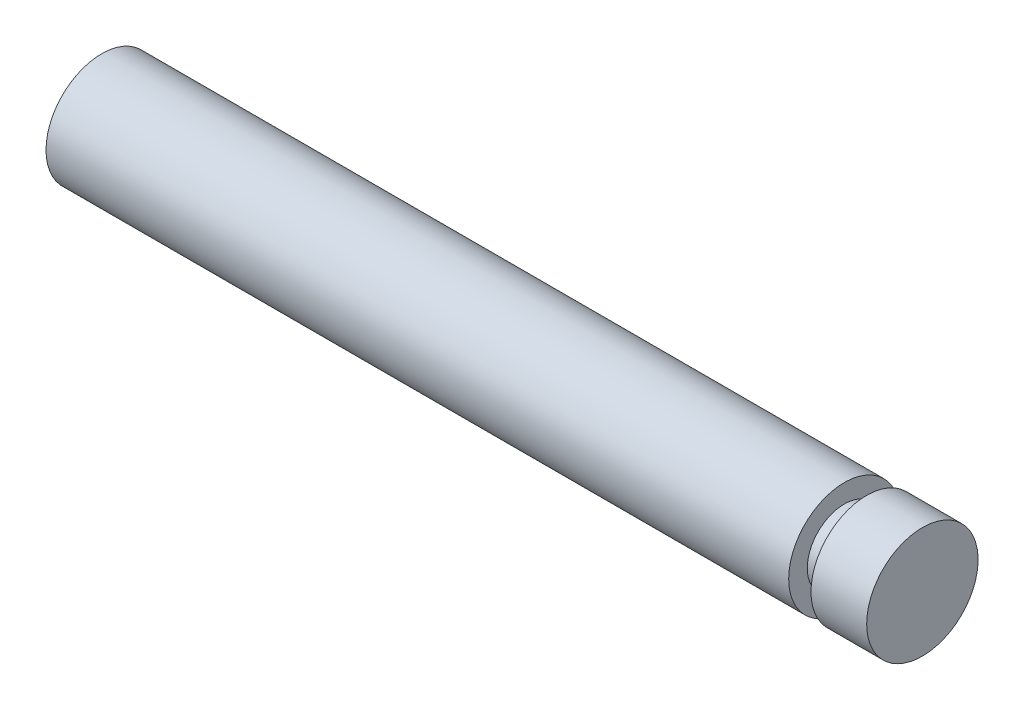
ISO-10303-21;
HEADER;
FILE_DESCRIPTION(('STEP AP214'),'2;1');
FILE_NAME('part.step','',(''),(''),'','','');
FILE_SCHEMA(('AUTOMOTIVE_DESIGN { 1 0 10303 214 1 1 1 1 }'));
ENDSEC;
DATA;
#1=APPLICATION_CONTEXT('core data for automotive mechanical design processes');
#2=APPLICATION_PROTOCOL_DEFINITION('international standard','automotive_design',2000,#1);
#3=PRODUCT_CONTEXT('',#1,'mechanical');
#4=PRODUCT('Part','Part','',(#3));
#5=PRODUCT_RELATED_PRODUCT_CATEGORY('part','',(#4));
#6=PRODUCT_DEFINITION_FORMATION('','',#4);
#7=PRODUCT_DEFINITION_CONTEXT('part definition',#1,'design');
#8=PRODUCT_DEFINITION('design','',#6,#7);
#9=PRODUCT_DEFINITION_SHAPE('','',#8);
#10=(LENGTH_UNIT() NAMED_UNIT(*) SI_UNIT(.MILLI.,.METRE.));
#11=(NAMED_UNIT(*) PLANE_ANGLE_UNIT() SI_UNIT($,.RADIAN.));
#12=(NAMED_UNIT(*) SI_UNIT($,.STERADIAN.) SOLID_ANGLE_UNIT());
#13=UNCERTAINTY_MEASURE_WITH_UNIT(LENGTH_MEASURE(1.E-05),#10,'distance_accuracy_value','');
#14=(GEOMETRIC_REPRESENTATION_CONTEXT(3) GLOBAL_UNCERTAINTY_ASSIGNED_CONTEXT((#13)) GLOBAL_UNIT_ASSIGNED_CONTEXT((#10,
#11,#12)) REPRESENTATION_CONTEXT('',''));
#15=CARTESIAN_POINT('',(0.,0.,0.));
#16=DIRECTION('',(0.,0.,1.));
#17=DIRECTION('',(1.,0.,0.));
#18=AXIS2_PLACEMENT_3D('',#15,#16,#17);
#19=CARTESIAN_POINT('',(0.,0.,0.));
#20=DIRECTION('',(1.,0.,0.));
#21=DIRECTION('',(0.,0.,-1.));
#22=AXIS2_PLACEMENT_3D('',#19,#20,#21);
#23=PLANE('',#22);
#24=CARTESIAN_POINT('',(0.,0.,0.));
#25=DIRECTION('',(-1.,0.,0.));
#26=DIRECTION('',(0.,0.,1.));
#27=AXIS2_PLACEMENT_3D('',#24,#25,#26);
#28=CIRCLE('',#27,3.);
#29=CARTESIAN_POINT('',(0.,0.,3.));
#30=VERTEX_POINT('',#29);
#31=EDGE_CURVE('E10',#30,#30,#28,.T.);
#32=ORIENTED_EDGE('',*,*,#31,.T.);
#33=EDGE_LOOP('',(#32));
#34=FACE_BOUND('',#33,.T.);
#35=ADVANCED_FACE('F43',(#34),#23,.F.);
#36=CARTESIAN_POINT('',(0.,0.,0.));
#37=DIRECTION('',(-1.,0.,0.));
#38=DIRECTION('',(0.,0.,1.));
#39=AXIS2_PLACEMENT_3D('',#36,#37,#38);
#40=CYLINDRICAL_SURFACE('',#39,3.);
#41=ORIENTED_EDGE('',*,*,#31,.F.);
#42=EDGE_LOOP('',(#41));
#43=FACE_BOUND('',#42,.T.);
#44=CARTESIAN_POINT('',(39.9915,0.,0.));
#45=DIRECTION('',(-1.,0.,0.));
#46=DIRECTION('',(0.,0.,1.));
#47=AXIS2_PLACEMENT_3D('',#44,#45,#46);
#48=CIRCLE('',#47,3.);
#49=CARTESIAN_POINT('',(39.9915,0.,3.));
#50=VERTEX_POINT('',#49);
#51=EDGE_CURVE('E50',#50,#50,#48,.T.);
#52=ORIENTED_EDGE('',*,*,#51,.T.);
#53=EDGE_LOOP('',(#52));
#54=FACE_BOUND('',#53,.T.);
#55=ADVANCED_FACE('F87',(#43,#54),#40,.T.);
#56=CARTESIAN_POINT('',(39.9915,3.,0.));
#57=DIRECTION('',(-1.,0.,0.));
#58=DIRECTION('',(0.,0.,1.));
#59=AXIS2_PLACEMENT_3D('',#56,#57,#58);
#60=PLANE('',#59);
#61=ORIENTED_EDGE('',*,*,#51,.F.);
#62=EDGE_LOOP('',(#61));
#63=FACE_BOUND('',#62,.T.);
#64=CARTESIAN_POINT('',(39.9915,0.,0.));
#65=DIRECTION('',(-1.,0.,0.));
#66=DIRECTION('',(0.,0.,1.));
#67=AXIS2_PLACEMENT_3D('',#64,#65,#66);
#68=CIRCLE('',#67,2.);
#69=CARTESIAN_POINT('',(39.9915,0.,2.));
#70=VERTEX_POINT('',#69);
#71=EDGE_CURVE('E55',#70,#70,#68,.T.);
#72=ORIENTED_EDGE('',*,*,#71,.T.);
#73=EDGE_LOOP('',(#72));
#74=FACE_BOUND('',#73,.T.);
#75=ADVANCED_FACE('F91',(#63,#74),#60,.F.);
#76=CARTESIAN_POINT('',(0.,0.,0.));
#77=DIRECTION('',(-1.,0.,0.));
#78=DIRECTION('',(0.,0.,1.));
#79=AXIS2_PLACEMENT_3D('',#76,#77,#78);
#80=CYLINDRICAL_SURFACE('',#79,2.);
#81=ORIENTED_EDGE('',*,*,#71,.F.);
#82=EDGE_LOOP('',(#81));
#83=FACE_BOUND('',#82,.T.);
#84=CARTESIAN_POINT('',(41.1915,0.,0.));
#85=DIRECTION('',(-1.,0.,0.));
#86=DIRECTION('',(0.,0.,1.));
#87=AXIS2_PLACEMENT_3D('',#84,#85,#86);
#88=CIRCLE('',#87,2.);
#89=CARTESIAN_POINT('',(41.1915,0.,2.));
#90=VERTEX_POINT('',#89);
#91=EDGE_CURVE('E60',#90,#90,#88,.T.);
#92=ORIENTED_EDGE('',*,*,#91,.T.);
#93=EDGE_LOOP('',(#92));
#94=FACE_BOUND('',#93,.T.);
#95=ADVANCED_FACE('F96',(#83,#94),#80,.T.);
#96=CARTESIAN_POINT('',(41.1915,2.,0.));
#97=DIRECTION('',(1.,0.,0.));
#98=DIRECTION('',(0.,0.,-1.));
#99=AXIS2_PLACEMENT_3D('',#96,#97,#98);
#100=PLANE('',#99);
#101=ORIENTED_EDGE('',*,*,#91,.F.);
#102=EDGE_LOOP('',(#101));
#103=FACE_BOUND('',#102,.T.);
#104=CARTESIAN_POINT('',(41.1915,0.,0.));
#105=DIRECTION('',(-1.,0.,0.));
#106=DIRECTION('',(0.,0.,1.));
#107=AXIS2_PLACEMENT_3D('',#104,#105,#106);
#108=CIRCLE('',#107,3.);
#109=CARTESIAN_POINT('',(41.1915,0.,3.));
#110=VERTEX_POINT('',#109);
#111=EDGE_CURVE('E66',#110,#110,#108,.T.);
#112=ORIENTED_EDGE('',*,*,#111,.T.);
#113=EDGE_LOOP('',(#112));
#114=FACE_BOUND('',#113,.T.);
#115=ADVANCED_FACE('F83',(#103,#114),#100,.F.);
#116=CARTESIAN_POINT('',(0.,0.,0.));
#117=DIRECTION('',(-1.,0.,0.));
#118=DIRECTION('',(0.,0.,1.));
#119=AXIS2_PLACEMENT_3D('',#116,#117,#118);
#120=CYLINDRICAL_SURFACE('',#119,3.);
#121=ORIENTED_EDGE('',*,*,#111,.F.);
#122=EDGE_LOOP('',(#121));
#123=FACE_BOUND('',#122,.T.);
#124=CARTESIAN_POINT('',(44.1915,0.,0.));
#125=DIRECTION('',(-1.,0.,0.));
#126=DIRECTION('',(0.,0.,1.));
#127=AXIS2_PLACEMENT_3D('',#124,#125,#126);
#128=CIRCLE('',#127,3.);
#129=CARTESIAN_POINT('',(44.1915,0.,3.));
#130=VERTEX_POINT('',#129);
#131=EDGE_CURVE('E70',#130,#130,#128,.T.);
#132=ORIENTED_EDGE('',*,*,#131,.T.);
#133=EDGE_LOOP('',(#132));
#134=FACE_BOUND('',#133,.T.);
#135=ADVANCED_FACE('F75',(#123,#134),#120,.T.);
#136=CARTESIAN_POINT('',(44.1915,3.,0.));
#137=DIRECTION('',(-1.,0.,0.));
#138=DIRECTION('',(0.,0.,1.));
#139=AXIS2_PLACEMENT_3D('',#136,#137,#138);
#140=PLANE('',#139);
#141=ORIENTED_EDGE('',*,*,#131,.F.);
#142=EDGE_LOOP('',(#141));
#143=FACE_BOUND('',#142,.T.);
#144=ADVANCED_FACE('F77',(#143),#140,.F.);
#145=CLOSED_SHELL('',(#35,#55,#75,#95,#115,#135,#144));
#146=MANIFOLD_SOLID_BREP('B2',#145);
#147=ADVANCED_BREP_SHAPE_REPRESENTATION('',(#18,#146),#14);
#148=SHAPE_DEFINITION_REPRESENTATION(#9,#147);
ENDSEC;
END-ISO-10303-21;
